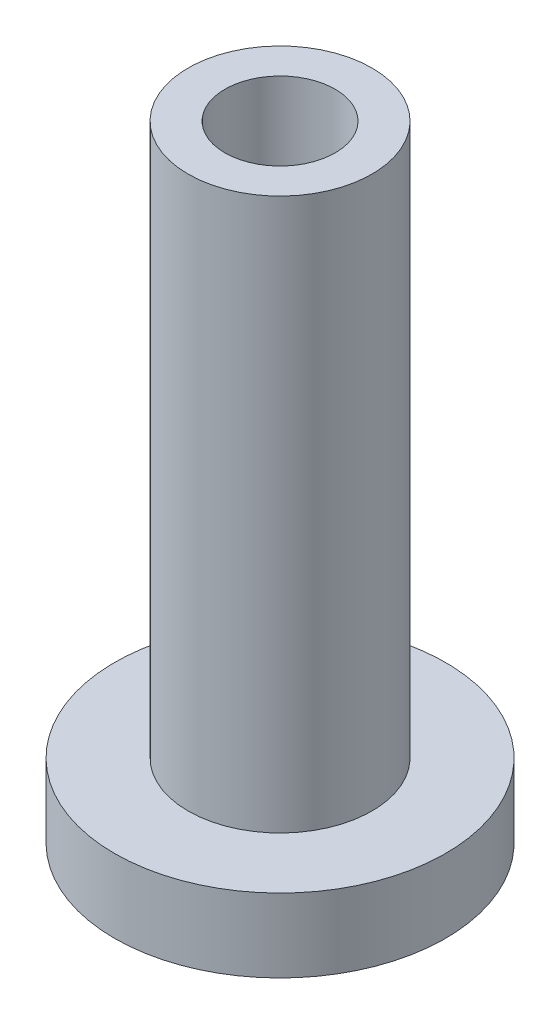
ISO-10303-21;
HEADER;
FILE_DESCRIPTION(('STEP AP214'),'2;1');
FILE_NAME('part.step','',(''),(''),'','','');
FILE_SCHEMA(('AUTOMOTIVE_DESIGN { 1 0 10303 214 1 1 1 1 }'));
ENDSEC;
DATA;
#1=APPLICATION_CONTEXT('core data for automotive mechanical design processes');
#2=APPLICATION_PROTOCOL_DEFINITION('international standard','automotive_design',2000,#1);
#3=PRODUCT_CONTEXT('',#1,'mechanical');
#4=PRODUCT('Part','Part','',(#3));
#5=PRODUCT_RELATED_PRODUCT_CATEGORY('part','',(#4));
#6=PRODUCT_DEFINITION_FORMATION('','',#4);
#7=PRODUCT_DEFINITION_CONTEXT('part definition',#1,'design');
#8=PRODUCT_DEFINITION('design','',#6,#7);
#9=PRODUCT_DEFINITION_SHAPE('','',#8);
#10=(LENGTH_UNIT() NAMED_UNIT(*) SI_UNIT(.MILLI.,.METRE.));
#11=(NAMED_UNIT(*) PLANE_ANGLE_UNIT() SI_UNIT($,.RADIAN.));
#12=(NAMED_UNIT(*) SI_UNIT($,.STERADIAN.) SOLID_ANGLE_UNIT());
#13=UNCERTAINTY_MEASURE_WITH_UNIT(LENGTH_MEASURE(1.E-05),#10,'distance_accuracy_value','');
#14=(GEOMETRIC_REPRESENTATION_CONTEXT(3) GLOBAL_UNCERTAINTY_ASSIGNED_CONTEXT((#13)) GLOBAL_UNIT_ASSIGNED_CONTEXT((#10,
#11,#12)) REPRESENTATION_CONTEXT('',''));
#15=CARTESIAN_POINT('',(0.,0.,0.));
#16=DIRECTION('',(0.,0.,1.));
#17=DIRECTION('',(1.,0.,0.));
#18=AXIS2_PLACEMENT_3D('',#15,#16,#17);
#19=CARTESIAN_POINT('',(0.,-2.,0.));
#20=DIRECTION('',(0.,1.,0.));
#21=DIRECTION('',(0.,0.,1.));
#22=AXIS2_PLACEMENT_3D('',#19,#20,#21);
#23=CYLINDRICAL_SURFACE('',#22,4.5);
#24=CARTESIAN_POINT('',(0.,-2.,0.));
#25=DIRECTION('',(0.,1.,0.));
#26=DIRECTION('',(0.,0.,1.));
#27=AXIS2_PLACEMENT_3D('',#24,#25,#26);
#28=CIRCLE('',#27,4.5);
#29=CARTESIAN_POINT('',(0.,-2.,4.5));
#30=VERTEX_POINT('',#29);
#31=EDGE_CURVE('E39',#30,#30,#28,.T.);
#32=ORIENTED_EDGE('',*,*,#31,.T.);
#33=EDGE_LOOP('',(#32));
#34=FACE_BOUND('',#33,.T.);
#35=CARTESIAN_POINT('',(0.,0.,0.));
#36=DIRECTION('',(0.,1.,0.));
#37=DIRECTION('',(0.,0.,1.));
#38=AXIS2_PLACEMENT_3D('',#35,#36,#37);
#39=CIRCLE('',#38,4.5);
#40=CARTESIAN_POINT('',(0.,0.,4.5));
#41=VERTEX_POINT('',#40);
#42=EDGE_CURVE('E35',#41,#41,#39,.T.);
#43=ORIENTED_EDGE('',*,*,#42,.F.);
#44=EDGE_LOOP('',(#43));
#45=FACE_BOUND('',#44,.T.);
#46=ADVANCED_FACE('F32',(#34,#45),#23,.T.);
#47=CARTESIAN_POINT('',(0.,-2.,0.));
#48=DIRECTION('',(0.,1.,0.));
#49=DIRECTION('',(0.,0.,1.));
#50=AXIS2_PLACEMENT_3D('',#47,#48,#49);
#51=PLANE('',#50);
#52=ORIENTED_EDGE('',*,*,#31,.F.);
#53=EDGE_LOOP('',(#52));
#54=FACE_BOUND('',#53,.T.);
#55=ADVANCED_FACE('F71',(#54),#51,.F.);
#56=CARTESIAN_POINT('',(0.,0.,0.));
#57=DIRECTION('',(0.,1.,0.));
#58=DIRECTION('',(0.,0.,1.));
#59=AXIS2_PLACEMENT_3D('',#56,#57,#58);
#60=PLANE('',#59);
#61=CARTESIAN_POINT('',(0.,0.,0.));
#62=DIRECTION('',(0.,1.,0.));
#63=DIRECTION('',(0.,0.,1.));
#64=AXIS2_PLACEMENT_3D('',#61,#62,#63);
#65=CIRCLE('',#64,2.5);
#66=CARTESIAN_POINT('',(0.,0.,2.5));
#67=VERTEX_POINT('',#66);
#68=EDGE_CURVE('E10',#67,#67,#65,.T.);
#69=ORIENTED_EDGE('',*,*,#68,.F.);
#70=EDGE_LOOP('',(#69));
#71=FACE_BOUND('',#70,.T.);
#72=ORIENTED_EDGE('',*,*,#42,.T.);
#73=EDGE_LOOP('',(#72));
#74=FACE_BOUND('',#73,.T.);
#75=ADVANCED_FACE('F66',(#71,#74),#60,.T.);
#76=CARTESIAN_POINT('',(0.,15.,0.));
#77=DIRECTION('',(0.,-1.,0.));
#78=DIRECTION('',(0.,0.,-1.));
#79=AXIS2_PLACEMENT_3D('',#76,#77,#78);
#80=CYLINDRICAL_SURFACE('',#79,2.5);
#81=CARTESIAN_POINT('',(0.,15.,0.));
#82=DIRECTION('',(0.,1.,0.));
#83=DIRECTION('',(0.,0.,1.));
#84=AXIS2_PLACEMENT_3D('',#81,#82,#83);
#85=CIRCLE('',#84,2.5);
#86=CARTESIAN_POINT('',(0.,15.,2.5));
#87=VERTEX_POINT('',#86);
#88=EDGE_CURVE('E45',#87,#87,#85,.T.);
#89=ORIENTED_EDGE('',*,*,#88,.F.);
#90=EDGE_LOOP('',(#89));
#91=FACE_BOUND('',#90,.T.);
#92=ORIENTED_EDGE('',*,*,#68,.T.);
#93=EDGE_LOOP('',(#92));
#94=FACE_BOUND('',#93,.T.);
#95=ADVANCED_FACE('F61',(#91,#94),#80,.T.);
#96=CARTESIAN_POINT('',(0.,15.,0.));
#97=DIRECTION('',(0.,1.,0.));
#98=DIRECTION('',(0.,0.,1.));
#99=AXIS2_PLACEMENT_3D('',#96,#97,#98);
#100=PLANE('',#99);
#101=CARTESIAN_POINT('',(0.,15.,0.));
#102=DIRECTION('',(0.,1.,0.));
#103=DIRECTION('',(0.,0.,1.));
#104=AXIS2_PLACEMENT_3D('',#101,#102,#103);
#105=CIRCLE('',#104,1.5);
#106=CARTESIAN_POINT('',(0.,15.,1.5));
#107=VERTEX_POINT('',#106);
#108=EDGE_CURVE('E48',#107,#107,#105,.T.);
#109=ORIENTED_EDGE('',*,*,#108,.F.);
#110=EDGE_LOOP('',(#109));
#111=FACE_BOUND('',#110,.T.);
#112=ORIENTED_EDGE('',*,*,#88,.T.);
#113=EDGE_LOOP('',(#112));
#114=FACE_BOUND('',#113,.T.);
#115=ADVANCED_FACE('F58',(#111,#114),#100,.T.);
#116=CARTESIAN_POINT('',(0.,15.,0.));
#117=DIRECTION('',(0.,-1.,0.));
#118=DIRECTION('',(0.,0.,-1.));
#119=AXIS2_PLACEMENT_3D('',#116,#117,#118);
#120=CYLINDRICAL_SURFACE('',#119,1.5);
#121=ORIENTED_EDGE('',*,*,#108,.T.);
#122=EDGE_LOOP('',(#121));
#123=FACE_BOUND('',#122,.T.);
#124=CARTESIAN_POINT('',(0.,0.,0.));
#125=DIRECTION('',(0.,1.,0.));
#126=DIRECTION('',(0.,0.,1.));
#127=AXIS2_PLACEMENT_3D('',#124,#125,#126);
#128=CIRCLE('',#127,1.5);
#129=CARTESIAN_POINT('',(0.,0.,1.5));
#130=VERTEX_POINT('',#129);
#131=EDGE_CURVE('E49',#130,#130,#128,.T.);
#132=ORIENTED_EDGE('',*,*,#131,.F.);
#133=EDGE_LOOP('',(#132));
#134=FACE_BOUND('',#133,.T.);
#135=ADVANCED_FACE('F55',(#123,#134),#120,.F.);
#136=CARTESIAN_POINT('',(0.,0.,0.));
#137=DIRECTION('',(0.,1.,0.));
#138=DIRECTION('',(0.,0.,1.));
#139=AXIS2_PLACEMENT_3D('',#136,#137,#138);
#140=PLANE('',#139);
#141=ORIENTED_EDGE('',*,*,#131,.T.);
#142=EDGE_LOOP('',(#141));
#143=FACE_BOUND('',#142,.T.);
#144=ADVANCED_FACE('F110',(#143),#140,.T.);
#145=CLOSED_SHELL('',(#46,#55,#75,#95,#115,#135,#144));
#146=MANIFOLD_SOLID_BREP('B2',#145);
#147=ADVANCED_BREP_SHAPE_REPRESENTATION('',(#18,#146),#14);
#148=SHAPE_DEFINITION_REPRESENTATION(#9,#147);
ENDSEC;
END-ISO-10303-21;
